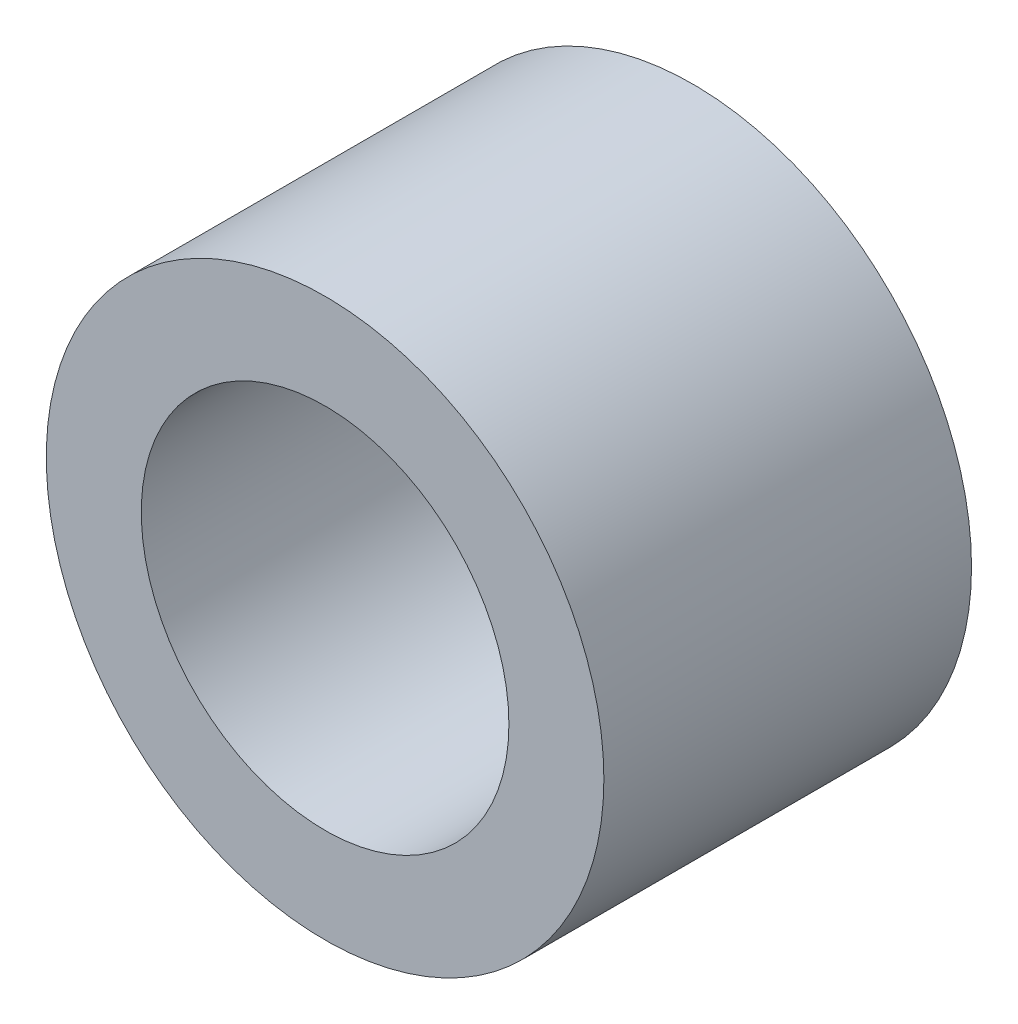
ISO-10303-21;
HEADER;
FILE_DESCRIPTION(('STEP AP214'),'2;1');
FILE_NAME('part.step','',(''),(''),'','','');
FILE_SCHEMA(('AUTOMOTIVE_DESIGN { 1 0 10303 214 1 1 1 1 }'));
ENDSEC;
DATA;
#1=APPLICATION_CONTEXT('core data for automotive mechanical design processes');
#2=APPLICATION_PROTOCOL_DEFINITION('international standard','automotive_design',2000,#1);
#3=PRODUCT_CONTEXT('',#1,'mechanical');
#4=PRODUCT('Part','Part','',(#3));
#5=PRODUCT_RELATED_PRODUCT_CATEGORY('part','',(#4));
#6=PRODUCT_DEFINITION_FORMATION('','',#4);
#7=PRODUCT_DEFINITION_CONTEXT('part definition',#1,'design');
#8=PRODUCT_DEFINITION('design','',#6,#7);
#9=PRODUCT_DEFINITION_SHAPE('','',#8);
#10=(LENGTH_UNIT() NAMED_UNIT(*) SI_UNIT(.MILLI.,.METRE.));
#11=(NAMED_UNIT(*) PLANE_ANGLE_UNIT() SI_UNIT($,.RADIAN.));
#12=(NAMED_UNIT(*) SI_UNIT($,.STERADIAN.) SOLID_ANGLE_UNIT());
#13=UNCERTAINTY_MEASURE_WITH_UNIT(LENGTH_MEASURE(1.E-05),#10,'distance_accuracy_value','');
#14=(GEOMETRIC_REPRESENTATION_CONTEXT(3) GLOBAL_UNCERTAINTY_ASSIGNED_CONTEXT((#13)) GLOBAL_UNIT_ASSIGNED_CONTEXT((#10,
#11,#12)) REPRESENTATION_CONTEXT('',''));
#15=CARTESIAN_POINT('',(0.,0.,0.));
#16=DIRECTION('',(0.,0.,1.));
#17=DIRECTION('',(1.,0.,0.));
#18=AXIS2_PLACEMENT_3D('',#15,#16,#17);
#19=CARTESIAN_POINT('',(0.,0.,3.));
#20=DIRECTION('',(0.,0.,1.));
#21=DIRECTION('',(1.,0.,0.));
#22=AXIS2_PLACEMENT_3D('',#19,#20,#21);
#23=PLANE('',#22);
#24=CARTESIAN_POINT('',(0.,0.,3.));
#25=DIRECTION('',(0.,0.,1.));
#26=DIRECTION('',(1.,0.,0.));
#27=AXIS2_PLACEMENT_3D('',#24,#25,#26);
#28=CIRCLE('',#27,2.275);
#29=CARTESIAN_POINT('',(2.275,0.,3.));
#30=VERTEX_POINT('',#29);
#31=EDGE_CURVE('E10',#30,#30,#28,.T.);
#32=ORIENTED_EDGE('',*,*,#31,.T.);
#33=EDGE_LOOP('',(#32));
#34=FACE_BOUND('',#33,.T.);
#35=CARTESIAN_POINT('',(0.,0.,3.));
#36=DIRECTION('',(0.,0.,1.));
#37=DIRECTION('',(1.,0.,0.));
#38=AXIS2_PLACEMENT_3D('',#35,#36,#37);
#39=CIRCLE('',#38,1.5);
#40=CARTESIAN_POINT('',(1.5,0.,3.));
#41=VERTEX_POINT('',#40);
#42=EDGE_CURVE('E50',#41,#41,#39,.T.);
#43=ORIENTED_EDGE('',*,*,#42,.F.);
#44=EDGE_LOOP('',(#43));
#45=FACE_BOUND('',#44,.T.);
#46=ADVANCED_FACE('F37',(#34,#45),#23,.T.);
#47=CARTESIAN_POINT('',(0.,0.,0.));
#48=DIRECTION('',(0.,0.,1.));
#49=DIRECTION('',(1.,0.,0.));
#50=AXIS2_PLACEMENT_3D('',#47,#48,#49);
#51=PLANE('',#50);
#52=CARTESIAN_POINT('',(0.,0.,0.));
#53=DIRECTION('',(0.,0.,1.));
#54=DIRECTION('',(1.,0.,0.));
#55=AXIS2_PLACEMENT_3D('',#52,#53,#54);
#56=CIRCLE('',#55,2.275);
#57=CARTESIAN_POINT('',(2.275,0.,0.));
#58=VERTEX_POINT('',#57);
#59=EDGE_CURVE('E41',#58,#58,#56,.T.);
#60=ORIENTED_EDGE('',*,*,#59,.F.);
#61=EDGE_LOOP('',(#60));
#62=FACE_BOUND('',#61,.T.);
#63=CARTESIAN_POINT('',(0.,0.,0.));
#64=DIRECTION('',(0.,0.,1.));
#65=DIRECTION('',(1.,0.,0.));
#66=AXIS2_PLACEMENT_3D('',#63,#64,#65);
#67=CIRCLE('',#66,1.5);
#68=CARTESIAN_POINT('',(1.5,0.,0.));
#69=VERTEX_POINT('',#68);
#70=EDGE_CURVE('E52',#69,#69,#67,.T.);
#71=ORIENTED_EDGE('',*,*,#70,.T.);
#72=EDGE_LOOP('',(#71));
#73=FACE_BOUND('',#72,.T.);
#74=ADVANCED_FACE('F64',(#62,#73),#51,.F.);
#75=CARTESIAN_POINT('',(0.,0.,3.));
#76=DIRECTION('',(0.,0.,-1.));
#77=DIRECTION('',(-1.,0.,0.));
#78=AXIS2_PLACEMENT_3D('',#75,#76,#77);
#79=CYLINDRICAL_SURFACE('',#78,2.275);
#80=ORIENTED_EDGE('',*,*,#31,.F.);
#81=EDGE_LOOP('',(#80));
#82=FACE_BOUND('',#81,.T.);
#83=ORIENTED_EDGE('',*,*,#59,.T.);
#84=EDGE_LOOP('',(#83));
#85=FACE_BOUND('',#84,.T.);
#86=ADVANCED_FACE('F39',(#82,#85),#79,.T.);
#87=CARTESIAN_POINT('',(0.,0.,3.));
#88=DIRECTION('',(0.,0.,-1.));
#89=DIRECTION('',(-1.,0.,0.));
#90=AXIS2_PLACEMENT_3D('',#87,#88,#89);
#91=CYLINDRICAL_SURFACE('',#90,1.5);
#92=ORIENTED_EDGE('',*,*,#42,.T.);
#93=EDGE_LOOP('',(#92));
#94=FACE_BOUND('',#93,.T.);
#95=ORIENTED_EDGE('',*,*,#70,.F.);
#96=EDGE_LOOP('',(#95));
#97=FACE_BOUND('',#96,.T.);
#98=ADVANCED_FACE('F60',(#94,#97),#91,.F.);
#99=CLOSED_SHELL('',(#46,#74,#86,#98));
#100=MANIFOLD_SOLID_BREP('B2',#99);
#101=ADVANCED_BREP_SHAPE_REPRESENTATION('',(#18,#100),#14);
#102=SHAPE_DEFINITION_REPRESENTATION(#9,#101);
ENDSEC;
END-ISO-10303-21;
